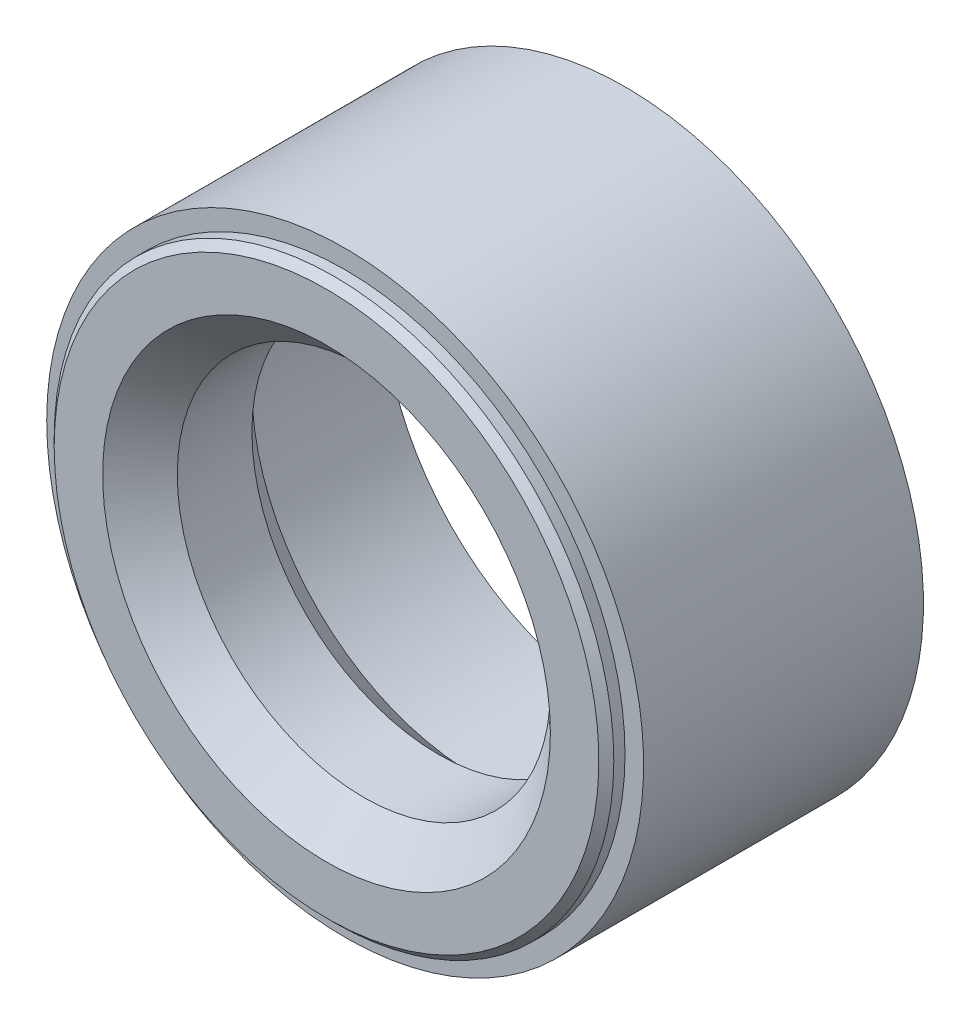
ISO-10303-21;
HEADER;
FILE_DESCRIPTION(('STEP AP214'),'2;1');
FILE_NAME('part.step','',(''),(''),'','','');
FILE_SCHEMA(('AUTOMOTIVE_DESIGN { 1 0 10303 214 1 1 1 1 }'));
ENDSEC;
DATA;
#1=APPLICATION_CONTEXT('core data for automotive mechanical design processes');
#2=APPLICATION_PROTOCOL_DEFINITION('international standard','automotive_design',2000,#1);
#3=PRODUCT_CONTEXT('',#1,'mechanical');
#4=PRODUCT('Part','Part','',(#3));
#5=PRODUCT_RELATED_PRODUCT_CATEGORY('part','',(#4));
#6=PRODUCT_DEFINITION_FORMATION('','',#4);
#7=PRODUCT_DEFINITION_CONTEXT('part definition',#1,'design');
#8=PRODUCT_DEFINITION('design','',#6,#7);
#9=PRODUCT_DEFINITION_SHAPE('','',#8);
#10=(LENGTH_UNIT() NAMED_UNIT(*) SI_UNIT(.MILLI.,.METRE.));
#11=(NAMED_UNIT(*) PLANE_ANGLE_UNIT() SI_UNIT($,.RADIAN.));
#12=(NAMED_UNIT(*) SI_UNIT($,.STERADIAN.) SOLID_ANGLE_UNIT());
#13=UNCERTAINTY_MEASURE_WITH_UNIT(LENGTH_MEASURE(1.E-05),#10,'distance_accuracy_value','');
#14=(GEOMETRIC_REPRESENTATION_CONTEXT(3) GLOBAL_UNCERTAINTY_ASSIGNED_CONTEXT((#13)) GLOBAL_UNIT_ASSIGNED_CONTEXT((#10,
#11,#12)) REPRESENTATION_CONTEXT('',''));
#15=CARTESIAN_POINT('',(0.,0.,0.));
#16=DIRECTION('',(0.,0.,1.));
#17=DIRECTION('',(1.,0.,0.));
#18=AXIS2_PLACEMENT_3D('',#15,#16,#17);
#19=CARTESIAN_POINT('',(-6.92288091738989,-11.2,41.2499999925494));
#20=DIRECTION('',(0.,0.,-1.));
#21=DIRECTION('',(-1.,0.,0.));
#22=AXIS2_PLACEMENT_3D('',#19,#20,#21);
#23=CYLINDRICAL_SURFACE('',#22,2.5);
#24=CARTESIAN_POINT('',(-6.92288091738989,-11.2,40.7499999924994));
#25=DIRECTION('',(0.,0.,-1.));
#26=DIRECTION('',(0.,-1.,0.));
#27=AXIS2_PLACEMENT_3D('',#24,#25,#26);
#28=CIRCLE('',#27,2.50000000002847);
#29=CARTESIAN_POINT('',(-6.92288091738989,-13.7000000000285,40.7499999924994));
#30=VERTEX_POINT('',#29);
#31=EDGE_CURVE('E49',#30,#30,#28,.T.);
#32=ORIENTED_EDGE('',*,*,#31,.T.);
#33=EDGE_LOOP('',(#32));
#34=FACE_BOUND('',#33,.T.);
#35=CARTESIAN_POINT('',(-6.92288091738989,-11.2,41.7499999925326));
#36=DIRECTION('',(0.,0.,1.));
#37=DIRECTION('',(0.,-1.,0.));
#38=AXIS2_PLACEMENT_3D('',#35,#36,#37);
#39=CIRCLE('',#38,2.49999999997162);
#40=CARTESIAN_POINT('',(-6.92288091738989,-13.6999999999716,41.7499999925326));
#41=VERTEX_POINT('',#40);
#42=EDGE_CURVE('E30',#41,#41,#39,.T.);
#43=ORIENTED_EDGE('',*,*,#42,.T.);
#44=EDGE_LOOP('',(#43));
#45=FACE_BOUND('',#44,.T.);
#46=ADVANCED_FACE('F15',(#34,#45),#23,.F.);
#47=CARTESIAN_POINT('',(-6.92288091738989,-11.2,42.2499999925776));
#48=DIRECTION('',(0.,0.,1.));
#49=DIRECTION('',(1.,0.,0.));
#50=AXIS2_PLACEMENT_3D('',#47,#48,#49);
#51=CONICAL_SURFACE('',#50,3.00000000001664,0.785398163397448);
#52=ORIENTED_EDGE('',*,*,#42,.F.);
#53=EDGE_LOOP('',(#52));
#54=FACE_BOUND('',#53,.T.);
#55=CARTESIAN_POINT('',(-6.92288091738989,-11.2,42.2499999925469));
#56=DIRECTION('',(0.,0.,1.));
#57=DIRECTION('',(1.,0.,0.));
#58=AXIS2_PLACEMENT_3D('',#55,#56,#57);
#59=CIRCLE('',#58,2.9999999999859);
#60=CARTESIAN_POINT('',(-3.92288091740399,-11.2,42.2499999925469));
#61=VERTEX_POINT('',#60);
#62=EDGE_CURVE('E18',#61,#61,#59,.F.);
#63=ORIENTED_EDGE('',*,*,#62,.F.);
#64=EDGE_LOOP('',(#63));
#65=FACE_BOUND('',#64,.T.);
#66=ADVANCED_FACE('F81',(#54,#65),#51,.F.);
#67=CARTESIAN_POINT('',(-6.92288091738989,-11.2,40.2499999925112));
#68=DIRECTION('',(0.,0.,-1.));
#69=DIRECTION('',(-1.,0.,0.));
#70=AXIS2_PLACEMENT_3D('',#67,#68,#69);
#71=CONICAL_SURFACE('',#70,3.00000000001664,0.785398163397448);
#72=ORIENTED_EDGE('',*,*,#31,.F.);
#73=EDGE_LOOP('',(#72));
#74=FACE_BOUND('',#73,.T.);
#75=CARTESIAN_POINT('',(-6.92288091738989,-11.2,40.249999992542));
#76=DIRECTION('',(0.,0.,-1.));
#77=DIRECTION('',(-1.,0.,0.));
#78=AXIS2_PLACEMENT_3D('',#75,#76,#77);
#79=CIRCLE('',#78,2.9999999999859);
#80=CARTESIAN_POINT('',(-9.92288091737579,-11.2,40.249999992542));
#81=VERTEX_POINT('',#80);
#82=EDGE_CURVE('E44',#81,#81,#79,.T.);
#83=ORIENTED_EDGE('',*,*,#82,.T.);
#84=EDGE_LOOP('',(#83));
#85=FACE_BOUND('',#84,.T.);
#86=ADVANCED_FACE('F72',(#74,#85),#71,.F.);
#87=CARTESIAN_POINT('',(-6.92288091738989,-11.2,42.2499999925494));
#88=DIRECTION('',(0.,0.,1.));
#89=DIRECTION('',(1.,0.,0.));
#90=AXIS2_PLACEMENT_3D('',#87,#88,#89);
#91=PLANE('',#90);
#92=ORIENTED_EDGE('',*,*,#62,.T.);
#93=EDGE_LOOP('',(#92));
#94=FACE_BOUND('',#93,.T.);
#95=CARTESIAN_POINT('',(-6.92288091738989,-11.2,42.2499999924674));
#96=DIRECTION('',(0.,0.,-1.));
#97=DIRECTION('',(-1.,0.,0.));
#98=AXIS2_PLACEMENT_3D('',#95,#96,#97);
#99=CIRCLE('',#98,3.65000000005011);
#100=CARTESIAN_POINT('',(-10.57288091744,-11.2,42.2499999924674));
#101=VERTEX_POINT('',#100);
#102=EDGE_CURVE('E42',#101,#101,#99,.T.);
#103=ORIENTED_EDGE('',*,*,#102,.F.);
#104=EDGE_LOOP('',(#103));
#105=FACE_BOUND('',#104,.T.);
#106=ADVANCED_FACE('F70',(#94,#105),#91,.T.);
#107=CARTESIAN_POINT('',(-6.92288091738989,-11.2,40.2499999925494));
#108=DIRECTION('',(0.,0.,1.));
#109=DIRECTION('',(1.,0.,0.));
#110=AXIS2_PLACEMENT_3D('',#107,#108,#109);
#111=PLANE('',#110);
#112=ORIENTED_EDGE('',*,*,#82,.F.);
#113=EDGE_LOOP('',(#112));
#114=FACE_BOUND('',#113,.T.);
#115=CARTESIAN_POINT('',(-6.92288091738989,-11.2,40.2499999925494));
#116=DIRECTION('',(0.,0.,1.));
#117=DIRECTION('',(1.,0.,0.));
#118=AXIS2_PLACEMENT_3D('',#115,#116,#117);
#119=CIRCLE('',#118,3.25);
#120=CARTESIAN_POINT('',(-3.67288091738989,-11.2,40.2499999925494));
#121=VERTEX_POINT('',#120);
#122=EDGE_CURVE('E39',#121,#121,#119,.F.);
#123=ORIENTED_EDGE('',*,*,#122,.T.);
#124=EDGE_LOOP('',(#123));
#125=FACE_BOUND('',#124,.T.);
#126=ADVANCED_FACE('F66',(#114,#125),#111,.F.);
#127=CARTESIAN_POINT('',(-6.92288091738989,-11.2,42.1499999926027));
#128=DIRECTION('',(0.,0.,-1.));
#129=DIRECTION('',(-1.,0.,0.));
#130=AXIS2_PLACEMENT_3D('',#127,#128,#129);
#131=CONICAL_SURFACE('',#130,3.74999999991475,0.785398163397448);
#132=CARTESIAN_POINT('',(-6.92288091738989,-11.2,42.1499999925494));
#133=DIRECTION('',(0.,0.,1.));
#134=DIRECTION('',(1.,0.,0.));
#135=AXIS2_PLACEMENT_3D('',#132,#133,#134);
#136=CIRCLE('',#135,3.75);
#137=CARTESIAN_POINT('',(-3.17288091738989,-11.2,42.1499999925494));
#138=VERTEX_POINT('',#137);
#139=EDGE_CURVE('E38',#138,#138,#136,.F.);
#140=ORIENTED_EDGE('',*,*,#139,.F.);
#141=EDGE_LOOP('',(#140));
#142=FACE_BOUND('',#141,.T.);
#143=ORIENTED_EDGE('',*,*,#102,.T.);
#144=EDGE_LOOP('',(#143));
#145=FACE_BOUND('',#144,.T.);
#146=ADVANCED_FACE('F62',(#142,#145),#131,.T.);
#147=CARTESIAN_POINT('',(-6.92288091738989,-11.2,39.2499999925494));
#148=DIRECTION('',(0.,0.,1.));
#149=DIRECTION('',(1.,0.,0.));
#150=AXIS2_PLACEMENT_3D('',#147,#148,#149);
#151=CYLINDRICAL_SURFACE('',#150,3.25);
#152=ORIENTED_EDGE('',*,*,#122,.F.);
#153=EDGE_LOOP('',(#152));
#154=FACE_BOUND('',#153,.T.);
#155=CARTESIAN_POINT('',(-6.92288091738989,-11.2,38.2499999925494));
#156=DIRECTION('',(0.,0.,1.));
#157=DIRECTION('',(1.,0.,0.));
#158=AXIS2_PLACEMENT_3D('',#155,#156,#157);
#159=CIRCLE('',#158,3.25);
#160=CARTESIAN_POINT('',(-3.67288091738989,-11.2,38.2499999925494));
#161=VERTEX_POINT('',#160);
#162=EDGE_CURVE('E35',#161,#161,#159,.T.);
#163=ORIENTED_EDGE('',*,*,#162,.F.);
#164=EDGE_LOOP('',(#163));
#165=FACE_BOUND('',#164,.T.);
#166=ADVANCED_FACE('F65',(#154,#165),#151,.F.);
#167=CARTESIAN_POINT('',(-6.92288091738989,-11.2,42.2999999925494));
#168=DIRECTION('',(0.,0.,1.));
#169=DIRECTION('',(1.,0.,0.));
#170=AXIS2_PLACEMENT_3D('',#167,#168,#169);
#171=CYLINDRICAL_SURFACE('',#170,3.75);
#172=CARTESIAN_POINT('',(-6.92288091738989,-11.2,41.9999999925494));
#173=DIRECTION('',(0.,0.,1.));
#174=DIRECTION('',(1.,0.,0.));
#175=AXIS2_PLACEMENT_3D('',#172,#173,#174);
#176=CIRCLE('',#175,3.75);
#177=CARTESIAN_POINT('',(-3.17288091738989,-11.2,41.9999999925494));
#178=VERTEX_POINT('',#177);
#179=EDGE_CURVE('E27',#178,#178,#176,.F.);
#180=ORIENTED_EDGE('',*,*,#179,.F.);
#181=EDGE_LOOP('',(#180));
#182=FACE_BOUND('',#181,.T.);
#183=ORIENTED_EDGE('',*,*,#139,.T.);
#184=EDGE_LOOP('',(#183));
#185=FACE_BOUND('',#184,.T.);
#186=ADVANCED_FACE('F60',(#182,#185),#171,.T.);
#187=CARTESIAN_POINT('',(-6.92288091738989,-11.2,38.2499999925494));
#188=DIRECTION('',(0.,0.,-1.));
#189=DIRECTION('',(-1.,0.,0.));
#190=AXIS2_PLACEMENT_3D('',#187,#188,#189);
#191=PLANE('',#190);
#192=ORIENTED_EDGE('',*,*,#162,.T.);
#193=EDGE_LOOP('',(#192));
#194=FACE_BOUND('',#193,.T.);
#195=CARTESIAN_POINT('',(-6.92288091738989,-11.2,38.2499999925494));
#196=DIRECTION('',(0.,0.,-1.));
#197=DIRECTION('',(-1.,0.,0.));
#198=AXIS2_PLACEMENT_3D('',#195,#196,#197);
#199=CIRCLE('',#198,4.);
#200=CARTESIAN_POINT('',(-10.9228809173899,-11.2,38.2499999925494));
#201=VERTEX_POINT('',#200);
#202=EDGE_CURVE('E22',#201,#201,#199,.F.);
#203=ORIENTED_EDGE('',*,*,#202,.F.);
#204=EDGE_LOOP('',(#203));
#205=FACE_BOUND('',#204,.T.);
#206=ADVANCED_FACE('F91',(#194,#205),#191,.T.);
#207=CARTESIAN_POINT('',(-6.92288091738989,-11.2,41.9999999925494));
#208=DIRECTION('',(0.,0.,1.));
#209=DIRECTION('',(1.,0.,0.));
#210=AXIS2_PLACEMENT_3D('',#207,#208,#209);
#211=PLANE('',#210);
#212=ORIENTED_EDGE('',*,*,#179,.T.);
#213=EDGE_LOOP('',(#212));
#214=FACE_BOUND('',#213,.T.);
#215=CARTESIAN_POINT('',(-6.92288091738989,-11.2,41.9999999925494));
#216=DIRECTION('',(0.,0.,-1.));
#217=DIRECTION('',(-1.,0.,0.));
#218=AXIS2_PLACEMENT_3D('',#215,#216,#217);
#219=CIRCLE('',#218,4.);
#220=CARTESIAN_POINT('',(-10.9228809173899,-11.2,41.9999999925494));
#221=VERTEX_POINT('',#220);
#222=EDGE_CURVE('E10',#221,#221,#219,.T.);
#223=ORIENTED_EDGE('',*,*,#222,.F.);
#224=EDGE_LOOP('',(#223));
#225=FACE_BOUND('',#224,.T.);
#226=ADVANCED_FACE('F86',(#214,#225),#211,.T.);
#227=CARTESIAN_POINT('',(-6.92288091738989,-11.2,41.2499999925494));
#228=DIRECTION('',(0.,0.,-1.));
#229=DIRECTION('',(-1.,0.,0.));
#230=AXIS2_PLACEMENT_3D('',#227,#228,#229);
#231=CYLINDRICAL_SURFACE('',#230,4.);
#232=ORIENTED_EDGE('',*,*,#222,.T.);
#233=EDGE_LOOP('',(#232));
#234=FACE_BOUND('',#233,.T.);
#235=ORIENTED_EDGE('',*,*,#202,.T.);
#236=EDGE_LOOP('',(#235));
#237=FACE_BOUND('',#236,.T.);
#238=ADVANCED_FACE('F84',(#234,#237),#231,.T.);
#239=CLOSED_SHELL('',(#46,#66,#86,#106,#126,#146,#166,#186,#206,#226,#238));
#240=MANIFOLD_SOLID_BREP('B1',#239);
#241=ADVANCED_BREP_SHAPE_REPRESENTATION('',(#18,#240),#14);
#242=SHAPE_DEFINITION_REPRESENTATION(#9,#241);
ENDSEC;
END-ISO-10303-21;
